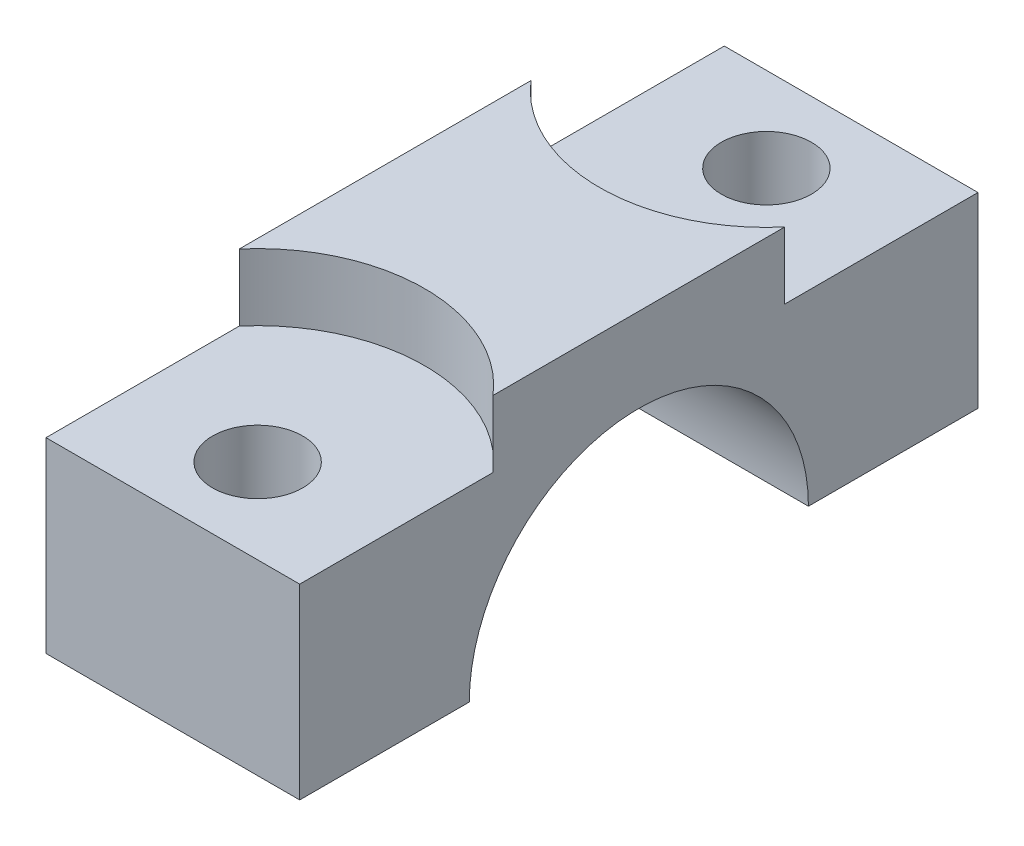
ISO-10303-21;
HEADER;
FILE_DESCRIPTION(('STEP AP214'),'2;1');
FILE_NAME('part.step','',(''),(''),'','','');
FILE_SCHEMA(('AUTOMOTIVE_DESIGN { 1 0 10303 214 1 1 1 1 }'));
ENDSEC;
DATA;
#1=APPLICATION_CONTEXT('core data for automotive mechanical design processes');
#2=APPLICATION_PROTOCOL_DEFINITION('international standard','automotive_design',2000,#1);
#3=PRODUCT_CONTEXT('',#1,'mechanical');
#4=PRODUCT('Part','Part','',(#3));
#5=PRODUCT_RELATED_PRODUCT_CATEGORY('part','',(#4));
#6=PRODUCT_DEFINITION_FORMATION('','',#4);
#7=PRODUCT_DEFINITION_CONTEXT('part definition',#1,'design');
#8=PRODUCT_DEFINITION('design','',#6,#7);
#9=PRODUCT_DEFINITION_SHAPE('','',#8);
#10=(LENGTH_UNIT() NAMED_UNIT(*) SI_UNIT(.MILLI.,.METRE.));
#11=(NAMED_UNIT(*) PLANE_ANGLE_UNIT() SI_UNIT($,.RADIAN.));
#12=(NAMED_UNIT(*) SI_UNIT($,.STERADIAN.) SOLID_ANGLE_UNIT());
#13=UNCERTAINTY_MEASURE_WITH_UNIT(LENGTH_MEASURE(1.E-05),#10,'distance_accuracy_value','');
#14=(GEOMETRIC_REPRESENTATION_CONTEXT(3) GLOBAL_UNCERTAINTY_ASSIGNED_CONTEXT((#13)) GLOBAL_UNIT_ASSIGNED_CONTEXT((#10,
#11,#12)) REPRESENTATION_CONTEXT('',''));
#15=CARTESIAN_POINT('',(0.,0.,0.));
#16=DIRECTION('',(0.,0.,1.));
#17=DIRECTION('',(1.,0.,0.));
#18=AXIS2_PLACEMENT_3D('',#15,#16,#17);
#19=CARTESIAN_POINT('',(9.5,19.,25.4));
#20=DIRECTION('',(0.,0.,-1.));
#21=DIRECTION('',(-1.,0.,0.));
#22=AXIS2_PLACEMENT_3D('',#19,#20,#21);
#23=PLANE('',#22);
#24=DIRECTION('',(0.,-1.,0.));
#25=VECTOR('',#24,1.);
#26=CARTESIAN_POINT('',(9.5,19.,25.4));
#27=LINE('',#26,#25);
#28=CARTESIAN_POINT('',(9.5,14.,25.4));
#29=VERTEX_POINT('',#28);
#30=CARTESIAN_POINT('',(9.5,0.,25.4));
#31=VERTEX_POINT('',#30);
#32=EDGE_CURVE('E154',#29,#31,#27,.T.);
#33=ORIENTED_EDGE('',*,*,#32,.F.);
#34=DIRECTION('',(-1.,0.,0.));
#35=VECTOR('',#34,1.);
#36=CARTESIAN_POINT('',(9.5,14.,25.4));
#37=LINE('',#36,#35);
#38=CARTESIAN_POINT('',(-9.5,14.,25.4));
#39=VERTEX_POINT('',#38);
#40=EDGE_CURVE('E150',#29,#39,#37,.T.);
#41=ORIENTED_EDGE('',*,*,#40,.T.);
#42=DIRECTION('',(0.,-1.,0.));
#43=VECTOR('',#42,1.);
#44=CARTESIAN_POINT('',(-9.5,19.,25.4));
#45=LINE('',#44,#43);
#46=CARTESIAN_POINT('',(-9.5,0.,25.4));
#47=VERTEX_POINT('',#46);
#48=EDGE_CURVE('E153',#39,#47,#45,.T.);
#49=ORIENTED_EDGE('',*,*,#48,.T.);
#50=DIRECTION('',(-1.,0.,0.));
#51=VECTOR('',#50,1.);
#52=CARTESIAN_POINT('',(9.5,0.,25.4));
#53=LINE('',#52,#51);
#54=EDGE_CURVE('E186',#31,#47,#53,.T.);
#55=ORIENTED_EDGE('',*,*,#54,.F.);
#56=EDGE_LOOP('',(#33,#41,#49,#55));
#57=FACE_BOUND('',#56,.T.);
#58=ADVANCED_FACE('F40',(#57),#23,.F.);
#59=CARTESIAN_POINT('',(9.5,0.,25.4));
#60=DIRECTION('',(0.,1.,0.));
#61=DIRECTION('',(0.,0.,1.));
#62=AXIS2_PLACEMENT_3D('',#59,#60,#61);
#63=PLANE('',#62);
#64=CARTESIAN_POINT('',(0.,0.,19.05));
#65=DIRECTION('',(0.,1.,0.));
#66=DIRECTION('',(0.,0.,1.));
#67=AXIS2_PLACEMENT_3D('',#64,#65,#66);
#68=CIRCLE('',#67,3.375);
#69=CARTESIAN_POINT('',(0.,0.,22.425));
#70=VERTEX_POINT('',#69);
#71=EDGE_CURVE('E147',#70,#70,#68,.T.);
#72=ORIENTED_EDGE('',*,*,#71,.T.);
#73=EDGE_LOOP('',(#72));
#74=FACE_BOUND('',#73,.T.);
#75=DIRECTION('',(0.,0.,-1.));
#76=VECTOR('',#75,1.);
#77=CARTESIAN_POINT('',(-9.5,0.,25.4));
#78=LINE('',#77,#76);
#79=CARTESIAN_POINT('',(-9.5,0.,12.7));
#80=VERTEX_POINT('',#79);
#81=EDGE_CURVE('E168',#47,#80,#78,.T.);
#82=ORIENTED_EDGE('',*,*,#81,.T.);
#83=DIRECTION('',(-1.,0.,0.));
#84=VECTOR('',#83,1.);
#85=CARTESIAN_POINT('',(9.5,0.,12.7));
#86=LINE('',#85,#84);
#87=CARTESIAN_POINT('',(9.5,0.,12.7));
#88=VERTEX_POINT('',#87);
#89=EDGE_CURVE('E183',#88,#80,#86,.T.);
#90=ORIENTED_EDGE('',*,*,#89,.F.);
#91=DIRECTION('',(0.,0.,-1.));
#92=VECTOR('',#91,1.);
#93=CARTESIAN_POINT('',(9.5,0.,25.4));
#94=LINE('',#93,#92);
#95=EDGE_CURVE('E156',#31,#88,#94,.T.);
#96=ORIENTED_EDGE('',*,*,#95,.F.);
#97=ORIENTED_EDGE('',*,*,#54,.T.);
#98=EDGE_LOOP('',(#82,#90,#96,#97));
#99=FACE_BOUND('',#98,.T.);
#100=ADVANCED_FACE('F230',(#74,#99),#63,.F.);
#101=CARTESIAN_POINT('',(9.5,0.,0.));
#102=DIRECTION('',(-1.,0.,0.));
#103=DIRECTION('',(0.,0.,1.));
#104=AXIS2_PLACEMENT_3D('',#101,#102,#103);
#105=CYLINDRICAL_SURFACE('',#104,12.7);
#106=CARTESIAN_POINT('',(-9.5,0.,0.));
#107=DIRECTION('',(-1.,0.,0.));
#108=DIRECTION('',(0.,0.,1.));
#109=AXIS2_PLACEMENT_3D('',#106,#107,#108);
#110=CIRCLE('',#109,12.7);
#111=CARTESIAN_POINT('',(-9.5,0.,-12.7));
#112=VERTEX_POINT('',#111);
#113=EDGE_CURVE('E170',#80,#112,#110,.T.);
#114=ORIENTED_EDGE('',*,*,#113,.T.);
#115=DIRECTION('',(-1.,0.,0.));
#116=VECTOR('',#115,1.);
#117=CARTESIAN_POINT('',(9.5,0.,-12.7));
#118=LINE('',#117,#116);
#119=CARTESIAN_POINT('',(9.5,0.,-12.7));
#120=VERTEX_POINT('',#119);
#121=EDGE_CURVE('E180',#120,#112,#118,.T.);
#122=ORIENTED_EDGE('',*,*,#121,.F.);
#123=CARTESIAN_POINT('',(9.5,0.,0.));
#124=DIRECTION('',(-1.,0.,0.));
#125=DIRECTION('',(0.,0.,1.));
#126=AXIS2_PLACEMENT_3D('',#123,#124,#125);
#127=CIRCLE('',#126,12.7);
#128=EDGE_CURVE('E159',#88,#120,#127,.T.);
#129=ORIENTED_EDGE('',*,*,#128,.F.);
#130=ORIENTED_EDGE('',*,*,#89,.T.);
#131=EDGE_LOOP('',(#114,#122,#129,#130));
#132=FACE_BOUND('',#131,.T.);
#133=ADVANCED_FACE('F226',(#132),#105,.F.);
#134=CARTESIAN_POINT('',(9.5,0.,-12.7));
#135=DIRECTION('',(0.,1.,0.));
#136=DIRECTION('',(0.,0.,1.));
#137=AXIS2_PLACEMENT_3D('',#134,#135,#136);
#138=PLANE('',#137);
#139=CARTESIAN_POINT('',(0.,0.,-19.05));
#140=DIRECTION('',(0.,1.,0.));
#141=DIRECTION('',(0.,0.,1.));
#142=AXIS2_PLACEMENT_3D('',#139,#140,#141);
#143=CIRCLE('',#142,3.375);
#144=CARTESIAN_POINT('',(0.,0.,-15.675));
#145=VERTEX_POINT('',#144);
#146=EDGE_CURVE('E137',#145,#145,#143,.T.);
#147=ORIENTED_EDGE('',*,*,#146,.T.);
#148=EDGE_LOOP('',(#147));
#149=FACE_BOUND('',#148,.T.);
#150=DIRECTION('',(0.,0.,-1.));
#151=VECTOR('',#150,1.);
#152=CARTESIAN_POINT('',(-9.5,0.,-12.7));
#153=LINE('',#152,#151);
#154=CARTESIAN_POINT('',(-9.5,0.,-25.4));
#155=VERTEX_POINT('',#154);
#156=EDGE_CURVE('E172',#112,#155,#153,.T.);
#157=ORIENTED_EDGE('',*,*,#156,.T.);
#158=DIRECTION('',(-1.,0.,0.));
#159=VECTOR('',#158,1.);
#160=CARTESIAN_POINT('',(9.5,0.,-25.4));
#161=LINE('',#160,#159);
#162=CARTESIAN_POINT('',(9.5,0.,-25.4));
#163=VERTEX_POINT('',#162);
#164=EDGE_CURVE('E166',#163,#155,#161,.T.);
#165=ORIENTED_EDGE('',*,*,#164,.F.);
#166=DIRECTION('',(0.,0.,-1.));
#167=VECTOR('',#166,1.);
#168=CARTESIAN_POINT('',(9.5,0.,-12.7));
#169=LINE('',#168,#167);
#170=EDGE_CURVE('E161',#120,#163,#169,.T.);
#171=ORIENTED_EDGE('',*,*,#170,.F.);
#172=ORIENTED_EDGE('',*,*,#121,.T.);
#173=EDGE_LOOP('',(#157,#165,#171,#172));
#174=FACE_BOUND('',#173,.T.);
#175=ADVANCED_FACE('F223',(#149,#174),#138,.F.);
#176=CARTESIAN_POINT('',(9.5,19.,-25.4));
#177=DIRECTION('',(0.,0.,1.));
#178=DIRECTION('',(1.,0.,0.));
#179=AXIS2_PLACEMENT_3D('',#176,#177,#178);
#180=PLANE('',#179);
#181=DIRECTION('',(0.,1.,0.));
#182=VECTOR('',#181,1.);
#183=CARTESIAN_POINT('',(-9.5,19.,-25.4));
#184=LINE('',#183,#182);
#185=CARTESIAN_POINT('',(-9.5,14.,-25.4));
#186=VERTEX_POINT('',#185);
#187=EDGE_CURVE('E174',#155,#186,#184,.T.);
#188=ORIENTED_EDGE('',*,*,#187,.T.);
#189=DIRECTION('',(1.,0.,0.));
#190=VECTOR('',#189,1.);
#191=CARTESIAN_POINT('',(9.5,14.,-25.4));
#192=LINE('',#191,#190);
#193=CARTESIAN_POINT('',(9.5,14.,-25.4));
#194=VERTEX_POINT('',#193);
#195=EDGE_CURVE('E54',#186,#194,#192,.T.);
#196=ORIENTED_EDGE('',*,*,#195,.T.);
#197=DIRECTION('',(0.,1.,0.));
#198=VECTOR('',#197,1.);
#199=CARTESIAN_POINT('',(9.5,19.,-25.4));
#200=LINE('',#199,#198);
#201=EDGE_CURVE('E135',#163,#194,#200,.T.);
#202=ORIENTED_EDGE('',*,*,#201,.F.);
#203=ORIENTED_EDGE('',*,*,#164,.T.);
#204=EDGE_LOOP('',(#188,#196,#202,#203));
#205=FACE_BOUND('',#204,.T.);
#206=ADVANCED_FACE('F219',(#205),#180,.F.);
#207=CARTESIAN_POINT('',(9.5,19.,25.4));
#208=DIRECTION('',(0.,-1.,0.));
#209=DIRECTION('',(0.,0.,-1.));
#210=AXIS2_PLACEMENT_3D('',#207,#208,#209);
#211=PLANE('',#210);
#212=DIRECTION('',(0.,0.,1.));
#213=VECTOR('',#212,1.);
#214=CARTESIAN_POINT('',(9.5,19.,25.4));
#215=LINE('',#214,#213);
#216=CARTESIAN_POINT('',(9.5,19.,-10.925961595364));
#217=VERTEX_POINT('',#216);
#218=CARTESIAN_POINT('',(9.5,19.,10.925961595364));
#219=VERTEX_POINT('',#218);
#220=EDGE_CURVE('E164',#217,#219,#215,.T.);
#221=ORIENTED_EDGE('',*,*,#220,.F.);
#222=CARTESIAN_POINT('',(0.,19.,-19.05));
#223=DIRECTION('',(0.,1.,0.));
#224=DIRECTION('',(0.,0.,1.));
#225=AXIS2_PLACEMENT_3D('',#222,#223,#224);
#226=CIRCLE('',#225,12.5);
#227=CARTESIAN_POINT('',(-9.5,19.,-10.925961595364));
#228=VERTEX_POINT('',#227);
#229=EDGE_CURVE('E122',#228,#217,#226,.T.);
#230=ORIENTED_EDGE('',*,*,#229,.F.);
#231=DIRECTION('',(0.,0.,1.));
#232=VECTOR('',#231,1.);
#233=CARTESIAN_POINT('',(-9.5,19.,25.4));
#234=LINE('',#233,#232);
#235=CARTESIAN_POINT('',(-9.5,19.,10.925961595364));
#236=VERTEX_POINT('',#235);
#237=EDGE_CURVE('E157',#228,#236,#234,.T.);
#238=ORIENTED_EDGE('',*,*,#237,.T.);
#239=CARTESIAN_POINT('',(0.,19.,19.05));
#240=DIRECTION('',(0.,1.,0.));
#241=DIRECTION('',(0.,0.,1.));
#242=AXIS2_PLACEMENT_3D('',#239,#240,#241);
#243=CIRCLE('',#242,12.5);
#244=EDGE_CURVE('E126',#219,#236,#243,.T.);
#245=ORIENTED_EDGE('',*,*,#244,.F.);
#246=EDGE_LOOP('',(#221,#230,#238,#245));
#247=FACE_BOUND('',#246,.T.);
#248=ADVANCED_FACE('F215',(#247),#211,.F.);
#249=CARTESIAN_POINT('',(9.5,0.,0.));
#250=DIRECTION('',(-1.,0.,0.));
#251=DIRECTION('',(0.,0.,1.));
#252=AXIS2_PLACEMENT_3D('',#249,#250,#251);
#253=PLANE('',#252);
#254=ORIENTED_EDGE('',*,*,#201,.T.);
#255=DIRECTION('',(0.,0.,1.));
#256=VECTOR('',#255,1.);
#257=CARTESIAN_POINT('',(9.5,14.,0.));
#258=LINE('',#257,#256);
#259=CARTESIAN_POINT('',(9.5,14.,-10.925961595364));
#260=VERTEX_POINT('',#259);
#261=EDGE_CURVE('E127',#194,#260,#258,.T.);
#262=ORIENTED_EDGE('',*,*,#261,.T.);
#263=DIRECTION('',(0.,1.,0.));
#264=VECTOR('',#263,1.);
#265=CARTESIAN_POINT('',(9.5,19.,-10.925961595364));
#266=LINE('',#265,#264);
#267=EDGE_CURVE('E116',#260,#217,#266,.T.);
#268=ORIENTED_EDGE('',*,*,#267,.T.);
#269=ORIENTED_EDGE('',*,*,#220,.T.);
#270=DIRECTION('',(0.,1.,0.));
#271=VECTOR('',#270,1.);
#272=CARTESIAN_POINT('',(9.5,19.,10.925961595364));
#273=LINE('',#272,#271);
#274=CARTESIAN_POINT('',(9.5,14.,10.925961595364));
#275=VERTEX_POINT('',#274);
#276=EDGE_CURVE('E189',#219,#275,#273,.F.);
#277=ORIENTED_EDGE('',*,*,#276,.T.);
#278=DIRECTION('',(0.,0.,1.));
#279=VECTOR('',#278,1.);
#280=CARTESIAN_POINT('',(9.5,14.,0.));
#281=LINE('',#280,#279);
#282=EDGE_CURVE('E192',#275,#29,#281,.T.);
#283=ORIENTED_EDGE('',*,*,#282,.T.);
#284=ORIENTED_EDGE('',*,*,#32,.T.);
#285=ORIENTED_EDGE('',*,*,#95,.T.);
#286=ORIENTED_EDGE('',*,*,#128,.T.);
#287=ORIENTED_EDGE('',*,*,#170,.T.);
#288=EDGE_LOOP('',(#254,#262,#268,#269,#277,#283,#284,#285,#286,#287));
#289=FACE_BOUND('',#288,.T.);
#290=ADVANCED_FACE('F133',(#289),#253,.F.);
#291=CARTESIAN_POINT('',(-9.5,0.,0.));
#292=DIRECTION('',(-1.,0.,0.));
#293=DIRECTION('',(0.,0.,1.));
#294=AXIS2_PLACEMENT_3D('',#291,#292,#293);
#295=PLANE('',#294);
#296=DIRECTION('',(0.,1.,0.));
#297=VECTOR('',#296,1.);
#298=CARTESIAN_POINT('',(-9.5,19.,-10.925961595364));
#299=LINE('',#298,#297);
#300=CARTESIAN_POINT('',(-9.5,14.,-10.925961595364));
#301=VERTEX_POINT('',#300);
#302=EDGE_CURVE('E11',#301,#228,#299,.T.);
#303=ORIENTED_EDGE('',*,*,#302,.F.);
#304=DIRECTION('',(0.,0.,1.));
#305=VECTOR('',#304,1.);
#306=CARTESIAN_POINT('',(-9.5,14.,0.));
#307=LINE('',#306,#305);
#308=EDGE_CURVE('E47',#186,#301,#307,.T.);
#309=ORIENTED_EDGE('',*,*,#308,.F.);
#310=ORIENTED_EDGE('',*,*,#187,.F.);
#311=ORIENTED_EDGE('',*,*,#156,.F.);
#312=ORIENTED_EDGE('',*,*,#113,.F.);
#313=ORIENTED_EDGE('',*,*,#81,.F.);
#314=ORIENTED_EDGE('',*,*,#48,.F.);
#315=DIRECTION('',(0.,0.,1.));
#316=VECTOR('',#315,1.);
#317=CARTESIAN_POINT('',(-9.5,14.,0.));
#318=LINE('',#317,#316);
#319=CARTESIAN_POINT('',(-9.5,14.,10.925961595364));
#320=VERTEX_POINT('',#319);
#321=EDGE_CURVE('E195',#320,#39,#318,.T.);
#322=ORIENTED_EDGE('',*,*,#321,.F.);
#323=DIRECTION('',(0.,1.,0.));
#324=VECTOR('',#323,1.);
#325=CARTESIAN_POINT('',(-9.5,19.,10.925961595364));
#326=LINE('',#325,#324);
#327=EDGE_CURVE('E197',#236,#320,#326,.F.);
#328=ORIENTED_EDGE('',*,*,#327,.F.);
#329=ORIENTED_EDGE('',*,*,#237,.F.);
#330=EDGE_LOOP('',(#303,#309,#310,#311,#312,#313,#314,#322,#328,#329));
#331=FACE_BOUND('',#330,.T.);
#332=ADVANCED_FACE('F207',(#331),#295,.T.);
#333=CARTESIAN_POINT('',(3.375,14.,19.05));
#334=DIRECTION('',(0.,-1.,0.));
#335=DIRECTION('',(0.,0.,-1.));
#336=AXIS2_PLACEMENT_3D('',#333,#334,#335);
#337=PLANE('',#336);
#338=CARTESIAN_POINT('',(0.,14.,19.05));
#339=DIRECTION('',(0.,1.,0.));
#340=DIRECTION('',(0.,0.,1.));
#341=AXIS2_PLACEMENT_3D('',#338,#339,#340);
#342=CIRCLE('',#341,3.375);
#343=CARTESIAN_POINT('',(0.,14.,22.425));
#344=VERTEX_POINT('',#343);
#345=EDGE_CURVE('E144',#344,#344,#342,.T.);
#346=ORIENTED_EDGE('',*,*,#345,.F.);
#347=EDGE_LOOP('',(#346));
#348=FACE_BOUND('',#347,.T.);
#349=CARTESIAN_POINT('',(0.,14.,19.05));
#350=DIRECTION('',(0.,1.,0.));
#351=DIRECTION('',(0.,0.,1.));
#352=AXIS2_PLACEMENT_3D('',#349,#350,#351);
#353=CIRCLE('',#352,12.5);
#354=EDGE_CURVE('E62',#275,#320,#353,.T.);
#355=ORIENTED_EDGE('',*,*,#354,.T.);
#356=ORIENTED_EDGE('',*,*,#321,.T.);
#357=ORIENTED_EDGE('',*,*,#40,.F.);
#358=ORIENTED_EDGE('',*,*,#282,.F.);
#359=EDGE_LOOP('',(#355,#356,#357,#358));
#360=FACE_BOUND('',#359,.T.);
#361=ADVANCED_FACE('F205',(#348,#360),#337,.F.);
#362=CARTESIAN_POINT('',(0.,19.,19.05));
#363=DIRECTION('',(0.,1.,0.));
#364=DIRECTION('',(0.,0.,1.));
#365=AXIS2_PLACEMENT_3D('',#362,#363,#364);
#366=CYLINDRICAL_SURFACE('',#365,3.375);
#367=ORIENTED_EDGE('',*,*,#71,.F.);
#368=EDGE_LOOP('',(#367));
#369=FACE_BOUND('',#368,.T.);
#370=ORIENTED_EDGE('',*,*,#345,.T.);
#371=EDGE_LOOP('',(#370));
#372=FACE_BOUND('',#371,.T.);
#373=ADVANCED_FACE('F250',(#369,#372),#366,.F.);
#374=CARTESIAN_POINT('',(0.,19.,19.05));
#375=DIRECTION('',(0.,1.,0.));
#376=DIRECTION('',(0.,0.,1.));
#377=AXIS2_PLACEMENT_3D('',#374,#375,#376);
#378=CYLINDRICAL_SURFACE('',#377,12.5);
#379=ORIENTED_EDGE('',*,*,#327,.T.);
#380=ORIENTED_EDGE('',*,*,#354,.F.);
#381=ORIENTED_EDGE('',*,*,#276,.F.);
#382=ORIENTED_EDGE('',*,*,#244,.T.);
#383=EDGE_LOOP('',(#379,#380,#381,#382));
#384=FACE_BOUND('',#383,.T.);
#385=ADVANCED_FACE('F199',(#384),#378,.F.);
#386=CARTESIAN_POINT('',(0.,19.,-19.05));
#387=DIRECTION('',(0.,1.,0.));
#388=DIRECTION('',(0.,0.,1.));
#389=AXIS2_PLACEMENT_3D('',#386,#387,#388);
#390=CYLINDRICAL_SURFACE('',#389,12.5);
#391=CARTESIAN_POINT('',(0.,14.,-19.05));
#392=DIRECTION('',(0.,1.,0.));
#393=DIRECTION('',(0.,0.,1.));
#394=AXIS2_PLACEMENT_3D('',#391,#392,#393);
#395=CIRCLE('',#394,12.5);
#396=EDGE_CURVE('E119',#301,#260,#395,.T.);
#397=ORIENTED_EDGE('',*,*,#396,.F.);
#398=ORIENTED_EDGE('',*,*,#302,.T.);
#399=ORIENTED_EDGE('',*,*,#229,.T.);
#400=ORIENTED_EDGE('',*,*,#267,.F.);
#401=EDGE_LOOP('',(#397,#398,#399,#400));
#402=FACE_BOUND('',#401,.T.);
#403=ADVANCED_FACE('F118',(#402),#390,.F.);
#404=CARTESIAN_POINT('',(3.375,14.,-19.05));
#405=DIRECTION('',(0.,-1.,0.));
#406=DIRECTION('',(0.,0.,-1.));
#407=AXIS2_PLACEMENT_3D('',#404,#405,#406);
#408=PLANE('',#407);
#409=CARTESIAN_POINT('',(0.,14.,-19.05));
#410=DIRECTION('',(0.,1.,0.));
#411=DIRECTION('',(0.,0.,1.));
#412=AXIS2_PLACEMENT_3D('',#409,#410,#411);
#413=CIRCLE('',#412,3.375);
#414=CARTESIAN_POINT('',(0.,14.,-15.675));
#415=VERTEX_POINT('',#414);
#416=EDGE_CURVE('E130',#415,#415,#413,.T.);
#417=ORIENTED_EDGE('',*,*,#416,.F.);
#418=EDGE_LOOP('',(#417));
#419=FACE_BOUND('',#418,.T.);
#420=ORIENTED_EDGE('',*,*,#195,.F.);
#421=ORIENTED_EDGE('',*,*,#308,.T.);
#422=ORIENTED_EDGE('',*,*,#396,.T.);
#423=ORIENTED_EDGE('',*,*,#261,.F.);
#424=EDGE_LOOP('',(#420,#421,#422,#423));
#425=FACE_BOUND('',#424,.T.);
#426=ADVANCED_FACE('F129',(#419,#425),#408,.F.);
#427=CARTESIAN_POINT('',(0.,19.,-19.05));
#428=DIRECTION('',(0.,1.,0.));
#429=DIRECTION('',(0.,0.,1.));
#430=AXIS2_PLACEMENT_3D('',#427,#428,#429);
#431=CYLINDRICAL_SURFACE('',#430,3.375);
#432=ORIENTED_EDGE('',*,*,#146,.F.);
#433=EDGE_LOOP('',(#432));
#434=FACE_BOUND('',#433,.T.);
#435=ORIENTED_EDGE('',*,*,#416,.T.);
#436=EDGE_LOOP('',(#435));
#437=FACE_BOUND('',#436,.T.);
#438=ADVANCED_FACE('F259',(#434,#437),#431,.F.);
#439=CLOSED_SHELL('',(#58,#100,#133,#175,#206,#248,#290,#332,#361,#373,#385,#403,#426,#438));
#440=MANIFOLD_SOLID_BREP('B2',#439);
#441=ADVANCED_BREP_SHAPE_REPRESENTATION('',(#18,#440),#14);
#442=SHAPE_DEFINITION_REPRESENTATION(#9,#441);
ENDSEC;
END-ISO-10303-21;
